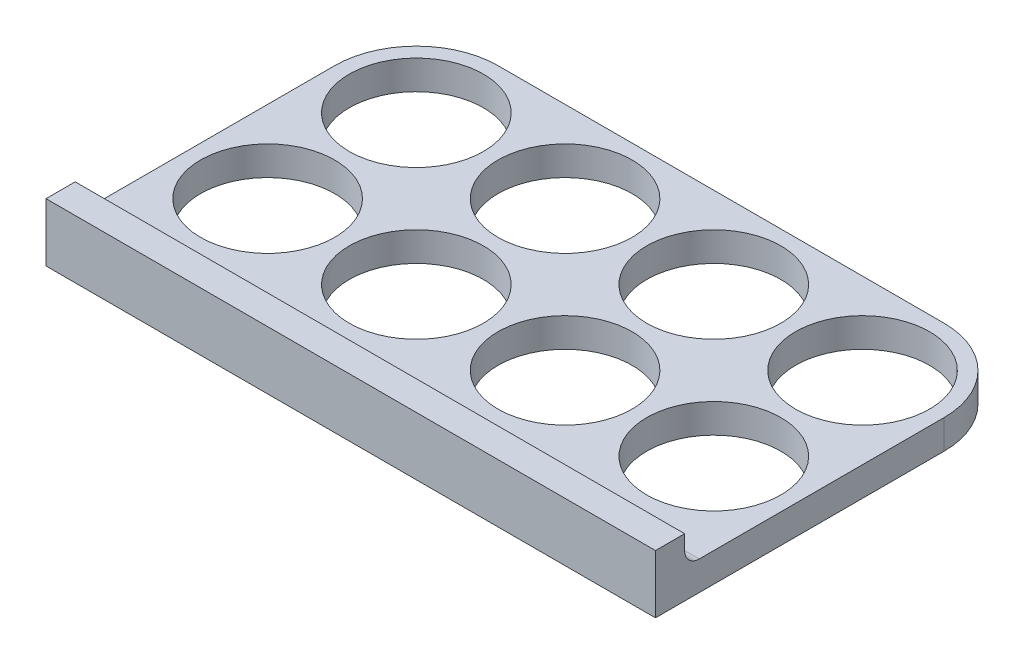
ISO-10303-21;
HEADER;
FILE_DESCRIPTION(('STEP AP214'),'2;1');
FILE_NAME('part.step','',(''),(''),'','','');
FILE_SCHEMA(('AUTOMOTIVE_DESIGN { 1 0 10303 214 1 1 1 1 }'));
ENDSEC;
DATA;
#1=APPLICATION_CONTEXT('core data for automotive mechanical design processes');
#2=APPLICATION_PROTOCOL_DEFINITION('international standard','automotive_design',2000,#1);
#3=PRODUCT_CONTEXT('',#1,'mechanical');
#4=PRODUCT('Part','Part','',(#3));
#5=PRODUCT_RELATED_PRODUCT_CATEGORY('part','',(#4));
#6=PRODUCT_DEFINITION_FORMATION('','',#4);
#7=PRODUCT_DEFINITION_CONTEXT('part definition',#1,'design');
#8=PRODUCT_DEFINITION('design','',#6,#7);
#9=PRODUCT_DEFINITION_SHAPE('','',#8);
#10=(LENGTH_UNIT() NAMED_UNIT(*) SI_UNIT(.MILLI.,.METRE.));
#11=(NAMED_UNIT(*) PLANE_ANGLE_UNIT() SI_UNIT($,.RADIAN.));
#12=(NAMED_UNIT(*) SI_UNIT($,.STERADIAN.) SOLID_ANGLE_UNIT());
#13=UNCERTAINTY_MEASURE_WITH_UNIT(LENGTH_MEASURE(1.E-05),#10,'distance_accuracy_value','');
#14=(GEOMETRIC_REPRESENTATION_CONTEXT(3) GLOBAL_UNCERTAINTY_ASSIGNED_CONTEXT((#13)) GLOBAL_UNIT_ASSIGNED_CONTEXT((#10,
#11,#12)) REPRESENTATION_CONTEXT('',''));
#15=CARTESIAN_POINT('',(0.,0.,0.));
#16=DIRECTION('',(0.,0.,1.));
#17=DIRECTION('',(1.,0.,0.));
#18=AXIS2_PLACEMENT_3D('',#15,#16,#17);
#19=CARTESIAN_POINT('',(0.,4.,-20.4));
#20=DIRECTION('',(0.,1.,0.));
#21=DIRECTION('',(0.,0.,1.));
#22=AXIS2_PLACEMENT_3D('',#19,#20,#21);
#23=PLANE('',#22);
#24=CARTESIAN_POINT('',(61.1999999999999,4.,-20.4));
#25=DIRECTION('',(0.,1.,0.));
#26=DIRECTION('',(0.,0.,1.));
#27=AXIS2_PLACEMENT_3D('',#24,#25,#26);
#28=CIRCLE('',#27,9.2);
#29=CARTESIAN_POINT('',(61.1999999999999,4.,-11.2));
#30=VERTEX_POINT('',#29);
#31=EDGE_CURVE('E146',#30,#30,#28,.T.);
#32=ORIENTED_EDGE('',*,*,#31,.F.);
#33=EDGE_LOOP('',(#32));
#34=FACE_BOUND('',#33,.T.);
#35=CARTESIAN_POINT('',(20.3999999999999,4.,-20.4));
#36=DIRECTION('',(0.,1.,0.));
#37=DIRECTION('',(0.,0.,1.));
#38=AXIS2_PLACEMENT_3D('',#35,#36,#37);
#39=CIRCLE('',#38,9.2);
#40=CARTESIAN_POINT('',(20.3999999999999,4.,-11.2));
#41=VERTEX_POINT('',#40);
#42=EDGE_CURVE('E158',#41,#41,#39,.T.);
#43=ORIENTED_EDGE('',*,*,#42,.F.);
#44=EDGE_LOOP('',(#43));
#45=FACE_BOUND('',#44,.T.);
#46=CARTESIAN_POINT('',(40.8,4.,0.));
#47=DIRECTION('',(0.,1.,0.));
#48=DIRECTION('',(0.,0.,1.));
#49=AXIS2_PLACEMENT_3D('',#46,#47,#48);
#50=CIRCLE('',#49,9.2);
#51=CARTESIAN_POINT('',(40.8,4.,9.2));
#52=VERTEX_POINT('',#51);
#53=EDGE_CURVE('E170',#52,#52,#50,.T.);
#54=ORIENTED_EDGE('',*,*,#53,.F.);
#55=EDGE_LOOP('',(#54));
#56=FACE_BOUND('',#55,.T.);
#57=CARTESIAN_POINT('',(0.,4.,0.));
#58=DIRECTION('',(0.,1.,0.));
#59=DIRECTION('',(0.,0.,1.));
#60=AXIS2_PLACEMENT_3D('',#57,#58,#59);
#61=CIRCLE('',#60,9.2);
#62=CARTESIAN_POINT('',(0.,4.,9.2));
#63=VERTEX_POINT('',#62);
#64=EDGE_CURVE('E182',#63,#63,#61,.T.);
#65=ORIENTED_EDGE('',*,*,#64,.F.);
#66=EDGE_LOOP('',(#65));
#67=FACE_BOUND('',#66,.T.);
#68=CARTESIAN_POINT('',(20.4,4.,0.));
#69=DIRECTION('',(0.,1.,0.));
#70=DIRECTION('',(0.,0.,1.));
#71=AXIS2_PLACEMENT_3D('',#68,#69,#70);
#72=CIRCLE('',#71,9.2);
#73=CARTESIAN_POINT('',(20.4,4.,9.2));
#74=VERTEX_POINT('',#73);
#75=EDGE_CURVE('E176',#74,#74,#72,.T.);
#76=ORIENTED_EDGE('',*,*,#75,.F.);
#77=EDGE_LOOP('',(#76));
#78=FACE_BOUND('',#77,.T.);
#79=CARTESIAN_POINT('',(61.2,4.,0.));
#80=DIRECTION('',(0.,1.,0.));
#81=DIRECTION('',(0.,0.,1.));
#82=AXIS2_PLACEMENT_3D('',#79,#80,#81);
#83=CIRCLE('',#82,9.2);
#84=CARTESIAN_POINT('',(61.2,4.,9.2));
#85=VERTEX_POINT('',#84);
#86=EDGE_CURVE('E164',#85,#85,#83,.T.);
#87=ORIENTED_EDGE('',*,*,#86,.F.);
#88=EDGE_LOOP('',(#87));
#89=FACE_BOUND('',#88,.T.);
#90=CARTESIAN_POINT('',(40.7999999999999,4.,-20.4));
#91=DIRECTION('',(0.,1.,0.));
#92=DIRECTION('',(0.,0.,1.));
#93=AXIS2_PLACEMENT_3D('',#90,#91,#92);
#94=CIRCLE('',#93,9.2);
#95=CARTESIAN_POINT('',(40.7999999999999,4.,-11.2));
#96=VERTEX_POINT('',#95);
#97=EDGE_CURVE('E152',#96,#96,#94,.T.);
#98=ORIENTED_EDGE('',*,*,#97,.F.);
#99=EDGE_LOOP('',(#98));
#100=FACE_BOUND('',#99,.T.);
#101=CARTESIAN_POINT('',(0.,4.,-20.4));
#102=DIRECTION('',(0.,1.,0.));
#103=DIRECTION('',(0.,0.,1.));
#104=AXIS2_PLACEMENT_3D('',#101,#102,#103);
#105=CIRCLE('',#104,9.2);
#106=CARTESIAN_POINT('',(0.,4.,-11.2));
#107=VERTEX_POINT('',#106);
#108=EDGE_CURVE('E140',#107,#107,#105,.T.);
#109=ORIENTED_EDGE('',*,*,#108,.F.);
#110=EDGE_LOOP('',(#109));
#111=FACE_BOUND('',#110,.T.);
#112=DIRECTION('',(0.,0.,1.));
#113=VECTOR('',#112,1.);
#114=CARTESIAN_POINT('',(-11.2000000000001,4.,-20.4));
#115=LINE('',#114,#113);
#116=CARTESIAN_POINT('',(-11.2000000000001,4.,-20.4));
#117=VERTEX_POINT('',#116);
#118=CARTESIAN_POINT('',(-11.2000000000001,4.,13.2));
#119=VERTEX_POINT('',#118);
#120=EDGE_CURVE('E191',#117,#119,#115,.T.);
#121=ORIENTED_EDGE('',*,*,#120,.T.);
#122=DIRECTION('',(1.,0.,0.));
#123=VECTOR('',#122,1.);
#124=CARTESIAN_POINT('',(72.3999999999999,4.,13.2));
#125=LINE('',#124,#123);
#126=CARTESIAN_POINT('',(72.3999999999999,4.,13.2));
#127=VERTEX_POINT('',#126);
#128=EDGE_CURVE('E228',#119,#127,#125,.T.);
#129=ORIENTED_EDGE('',*,*,#128,.T.);
#130=DIRECTION('',(0.,0.,-1.));
#131=VECTOR('',#130,1.);
#132=CARTESIAN_POINT('',(72.3999999999999,4.,19.2));
#133=LINE('',#132,#131);
#134=CARTESIAN_POINT('',(72.3999999999999,4.,-20.4));
#135=VERTEX_POINT('',#134);
#136=EDGE_CURVE('E195',#127,#135,#133,.T.);
#137=ORIENTED_EDGE('',*,*,#136,.T.);
#138=CARTESIAN_POINT('',(61.1999999999999,4.,-20.4));
#139=DIRECTION('',(0.,1.,0.));
#140=DIRECTION('',(0.,0.,1.));
#141=AXIS2_PLACEMENT_3D('',#138,#139,#140);
#142=CIRCLE('',#141,11.2);
#143=CARTESIAN_POINT('',(61.1999999999999,4.,-31.6));
#144=VERTEX_POINT('',#143);
#145=EDGE_CURVE('E197',#135,#144,#142,.T.);
#146=ORIENTED_EDGE('',*,*,#145,.T.);
#147=DIRECTION('',(-1.,0.,0.));
#148=VECTOR('',#147,1.);
#149=CARTESIAN_POINT('',(0.,4.,-31.6));
#150=LINE('',#149,#148);
#151=CARTESIAN_POINT('',(0.,4.,-31.6));
#152=VERTEX_POINT('',#151);
#153=EDGE_CURVE('E199',#144,#152,#150,.T.);
#154=ORIENTED_EDGE('',*,*,#153,.T.);
#155=CARTESIAN_POINT('',(0.,4.,-20.4));
#156=DIRECTION('',(0.,1.,0.));
#157=DIRECTION('',(0.,0.,1.));
#158=AXIS2_PLACEMENT_3D('',#155,#156,#157);
#159=CIRCLE('',#158,11.2);
#160=EDGE_CURVE('E188',#152,#117,#159,.T.);
#161=ORIENTED_EDGE('',*,*,#160,.T.);
#162=EDGE_LOOP('',(#121,#129,#137,#146,#154,#161));
#163=FACE_BOUND('',#162,.T.);
#164=ADVANCED_FACE('F44',(#34,#45,#56,#67,#78,#89,#100,#111,#163),#23,.T.);
#165=CARTESIAN_POINT('',(0.,0.,-20.4));
#166=DIRECTION('',(0.,1.,0.));
#167=DIRECTION('',(0.,0.,1.));
#168=AXIS2_PLACEMENT_3D('',#165,#166,#167);
#169=PLANE('',#168);
#170=CARTESIAN_POINT('',(0.,0.,-20.4));
#171=DIRECTION('',(0.,1.,0.));
#172=DIRECTION('',(0.,0.,1.));
#173=AXIS2_PLACEMENT_3D('',#170,#171,#172);
#174=CIRCLE('',#173,11.2);
#175=CARTESIAN_POINT('',(0.,0.,-31.6));
#176=VERTEX_POINT('',#175);
#177=CARTESIAN_POINT('',(-11.2000000000001,0.,-20.4));
#178=VERTEX_POINT('',#177);
#179=EDGE_CURVE('E185',#176,#178,#174,.T.);
#180=ORIENTED_EDGE('',*,*,#179,.F.);
#181=DIRECTION('',(-1.,0.,0.));
#182=VECTOR('',#181,1.);
#183=CARTESIAN_POINT('',(0.,0.,-31.6));
#184=LINE('',#183,#182);
#185=CARTESIAN_POINT('',(61.1999999999999,0.,-31.6));
#186=VERTEX_POINT('',#185);
#187=EDGE_CURVE('E192',#186,#176,#184,.T.);
#188=ORIENTED_EDGE('',*,*,#187,.F.);
#189=CARTESIAN_POINT('',(61.1999999999999,0.,-20.4));
#190=DIRECTION('',(0.,1.,0.));
#191=DIRECTION('',(0.,0.,1.));
#192=AXIS2_PLACEMENT_3D('',#189,#190,#191);
#193=CIRCLE('',#192,11.2);
#194=CARTESIAN_POINT('',(72.3999999999999,0.,-20.4));
#195=VERTEX_POINT('',#194);
#196=EDGE_CURVE('E210',#195,#186,#193,.T.);
#197=ORIENTED_EDGE('',*,*,#196,.F.);
#198=DIRECTION('',(0.,0.,-1.));
#199=VECTOR('',#198,1.);
#200=CARTESIAN_POINT('',(72.3999999999999,0.,19.2));
#201=LINE('',#200,#199);
#202=CARTESIAN_POINT('',(72.3999999999999,0.,19.2));
#203=VERTEX_POINT('',#202);
#204=EDGE_CURVE('E208',#203,#195,#201,.T.);
#205=ORIENTED_EDGE('',*,*,#204,.F.);
#206=DIRECTION('',(1.,0.,0.));
#207=VECTOR('',#206,1.);
#208=CARTESIAN_POINT('',(-11.2000000000001,0.,19.2));
#209=LINE('',#208,#207);
#210=CARTESIAN_POINT('',(-11.2000000000001,0.,19.2));
#211=VERTEX_POINT('',#210);
#212=EDGE_CURVE('E206',#211,#203,#209,.T.);
#213=ORIENTED_EDGE('',*,*,#212,.F.);
#214=DIRECTION('',(0.,0.,1.));
#215=VECTOR('',#214,1.);
#216=CARTESIAN_POINT('',(-11.2000000000001,0.,-20.4));
#217=LINE('',#216,#215);
#218=EDGE_CURVE('E204',#178,#211,#217,.T.);
#219=ORIENTED_EDGE('',*,*,#218,.F.);
#220=EDGE_LOOP('',(#180,#188,#197,#205,#213,#219));
#221=FACE_BOUND('',#220,.T.);
#222=CARTESIAN_POINT('',(0.,0.,0.));
#223=DIRECTION('',(0.,1.,0.));
#224=DIRECTION('',(0.,0.,1.));
#225=AXIS2_PLACEMENT_3D('',#222,#223,#224);
#226=CIRCLE('',#225,9.2);
#227=CARTESIAN_POINT('',(0.,0.,9.2));
#228=VERTEX_POINT('',#227);
#229=EDGE_CURVE('E179',#228,#228,#226,.T.);
#230=ORIENTED_EDGE('',*,*,#229,.T.);
#231=EDGE_LOOP('',(#230));
#232=FACE_BOUND('',#231,.T.);
#233=CARTESIAN_POINT('',(20.4,0.,0.));
#234=DIRECTION('',(0.,1.,0.));
#235=DIRECTION('',(0.,0.,1.));
#236=AXIS2_PLACEMENT_3D('',#233,#234,#235);
#237=CIRCLE('',#236,9.2);
#238=CARTESIAN_POINT('',(20.4,0.,9.2));
#239=VERTEX_POINT('',#238);
#240=EDGE_CURVE('E173',#239,#239,#237,.T.);
#241=ORIENTED_EDGE('',*,*,#240,.T.);
#242=EDGE_LOOP('',(#241));
#243=FACE_BOUND('',#242,.T.);
#244=CARTESIAN_POINT('',(40.8,0.,0.));
#245=DIRECTION('',(0.,1.,0.));
#246=DIRECTION('',(0.,0.,1.));
#247=AXIS2_PLACEMENT_3D('',#244,#245,#246);
#248=CIRCLE('',#247,9.2);
#249=CARTESIAN_POINT('',(40.8,0.,9.2));
#250=VERTEX_POINT('',#249);
#251=EDGE_CURVE('E167',#250,#250,#248,.T.);
#252=ORIENTED_EDGE('',*,*,#251,.T.);
#253=EDGE_LOOP('',(#252));
#254=FACE_BOUND('',#253,.T.);
#255=CARTESIAN_POINT('',(61.2,0.,0.));
#256=DIRECTION('',(0.,1.,0.));
#257=DIRECTION('',(0.,0.,1.));
#258=AXIS2_PLACEMENT_3D('',#255,#256,#257);
#259=CIRCLE('',#258,9.2);
#260=CARTESIAN_POINT('',(61.2,0.,9.2));
#261=VERTEX_POINT('',#260);
#262=EDGE_CURVE('E161',#261,#261,#259,.T.);
#263=ORIENTED_EDGE('',*,*,#262,.T.);
#264=EDGE_LOOP('',(#263));
#265=FACE_BOUND('',#264,.T.);
#266=CARTESIAN_POINT('',(20.3999999999999,0.,-20.4));
#267=DIRECTION('',(0.,1.,0.));
#268=DIRECTION('',(0.,0.,1.));
#269=AXIS2_PLACEMENT_3D('',#266,#267,#268);
#270=CIRCLE('',#269,9.2);
#271=CARTESIAN_POINT('',(20.3999999999999,0.,-11.2));
#272=VERTEX_POINT('',#271);
#273=EDGE_CURVE('E155',#272,#272,#270,.T.);
#274=ORIENTED_EDGE('',*,*,#273,.T.);
#275=EDGE_LOOP('',(#274));
#276=FACE_BOUND('',#275,.T.);
#277=CARTESIAN_POINT('',(40.7999999999999,0.,-20.4));
#278=DIRECTION('',(0.,1.,0.));
#279=DIRECTION('',(0.,0.,1.));
#280=AXIS2_PLACEMENT_3D('',#277,#278,#279);
#281=CIRCLE('',#280,9.2);
#282=CARTESIAN_POINT('',(40.7999999999999,0.,-11.2));
#283=VERTEX_POINT('',#282);
#284=EDGE_CURVE('E149',#283,#283,#281,.T.);
#285=ORIENTED_EDGE('',*,*,#284,.T.);
#286=EDGE_LOOP('',(#285));
#287=FACE_BOUND('',#286,.T.);
#288=CARTESIAN_POINT('',(61.1999999999999,0.,-20.4));
#289=DIRECTION('',(0.,1.,0.));
#290=DIRECTION('',(0.,0.,1.));
#291=AXIS2_PLACEMENT_3D('',#288,#289,#290);
#292=CIRCLE('',#291,9.2);
#293=CARTESIAN_POINT('',(61.1999999999999,0.,-11.2));
#294=VERTEX_POINT('',#293);
#295=EDGE_CURVE('E143',#294,#294,#292,.T.);
#296=ORIENTED_EDGE('',*,*,#295,.T.);
#297=EDGE_LOOP('',(#296));
#298=FACE_BOUND('',#297,.T.);
#299=CARTESIAN_POINT('',(0.,0.,-20.4));
#300=DIRECTION('',(0.,1.,0.));
#301=DIRECTION('',(0.,0.,1.));
#302=AXIS2_PLACEMENT_3D('',#299,#300,#301);
#303=CIRCLE('',#302,9.2);
#304=CARTESIAN_POINT('',(0.,0.,-11.2));
#305=VERTEX_POINT('',#304);
#306=EDGE_CURVE('E119',#305,#305,#303,.T.);
#307=ORIENTED_EDGE('',*,*,#306,.T.);
#308=EDGE_LOOP('',(#307));
#309=FACE_BOUND('',#308,.T.);
#310=ADVANCED_FACE('F258',(#221,#232,#243,#254,#265,#276,#287,#298,#309),#169,.F.);
#311=CARTESIAN_POINT('',(0.,4.,-20.4));
#312=DIRECTION('',(0.,-1.,0.));
#313=DIRECTION('',(0.,0.,-1.));
#314=AXIS2_PLACEMENT_3D('',#311,#312,#313);
#315=CYLINDRICAL_SURFACE('',#314,11.2);
#316=ORIENTED_EDGE('',*,*,#179,.T.);
#317=DIRECTION('',(0.,-1.,0.));
#318=VECTOR('',#317,1.);
#319=CARTESIAN_POINT('',(-11.2000000000001,4.,-20.4));
#320=LINE('',#319,#318);
#321=EDGE_CURVE('E225',#117,#178,#320,.T.);
#322=ORIENTED_EDGE('',*,*,#321,.F.);
#323=ORIENTED_EDGE('',*,*,#160,.F.);
#324=DIRECTION('',(0.,-1.,0.));
#325=VECTOR('',#324,1.);
#326=CARTESIAN_POINT('',(0.,4.,-31.6));
#327=LINE('',#326,#325);
#328=EDGE_CURVE('E201',#152,#176,#327,.T.);
#329=ORIENTED_EDGE('',*,*,#328,.T.);
#330=EDGE_LOOP('',(#316,#322,#323,#329));
#331=FACE_BOUND('',#330,.T.);
#332=ADVANCED_FACE('F251',(#331),#315,.T.);
#333=CARTESIAN_POINT('',(-11.2000000000001,4.,-20.4));
#334=DIRECTION('',(1.,0.,0.));
#335=DIRECTION('',(0.,0.,-1.));
#336=AXIS2_PLACEMENT_3D('',#333,#334,#335);
#337=PLANE('',#336);
#338=ORIENTED_EDGE('',*,*,#218,.T.);
#339=DIRECTION('',(0.,-1.,0.));
#340=VECTOR('',#339,1.);
#341=CARTESIAN_POINT('',(-11.2000000000001,4.,19.2));
#342=LINE('',#341,#340);
#343=CARTESIAN_POINT('',(-11.2000000000001,8.,19.2));
#344=VERTEX_POINT('',#343);
#345=EDGE_CURVE('E126',#344,#211,#342,.T.);
#346=ORIENTED_EDGE('',*,*,#345,.F.);
#347=DIRECTION('',(0.,0.,1.));
#348=VECTOR('',#347,1.);
#349=CARTESIAN_POINT('',(-11.2000000000001,8.,0.));
#350=LINE('',#349,#348);
#351=CARTESIAN_POINT('',(-11.2000000000001,8.,15.2));
#352=VERTEX_POINT('',#351);
#353=EDGE_CURVE('E123',#352,#344,#350,.T.);
#354=ORIENTED_EDGE('',*,*,#353,.F.);
#355=DIRECTION('',(0.,-1.,0.));
#356=VECTOR('',#355,1.);
#357=CARTESIAN_POINT('',(-11.2000000000001,8.,15.2));
#358=LINE('',#357,#356);
#359=CARTESIAN_POINT('',(-11.2000000000001,6.,15.2));
#360=VERTEX_POINT('',#359);
#361=EDGE_CURVE('E112',#352,#360,#358,.T.);
#362=ORIENTED_EDGE('',*,*,#361,.T.);
#363=CARTESIAN_POINT('',(-11.2000000000001,6.,13.2));
#364=DIRECTION('',(1.,0.,0.));
#365=DIRECTION('',(0.,0.,-1.));
#366=AXIS2_PLACEMENT_3D('',#363,#364,#365);
#367=CIRCLE('',#366,2.);
#368=EDGE_CURVE('E11',#360,#119,#367,.T.);
#369=ORIENTED_EDGE('',*,*,#368,.T.);
#370=ORIENTED_EDGE('',*,*,#120,.F.);
#371=ORIENTED_EDGE('',*,*,#321,.T.);
#372=EDGE_LOOP('',(#338,#346,#354,#362,#369,#370,#371));
#373=FACE_BOUND('',#372,.T.);
#374=ADVANCED_FACE('F124',(#373),#337,.F.);
#375=CARTESIAN_POINT('',(-11.2000000000001,4.,19.2));
#376=DIRECTION('',(0.,0.,-1.));
#377=DIRECTION('',(-1.,0.,0.));
#378=AXIS2_PLACEMENT_3D('',#375,#376,#377);
#379=PLANE('',#378);
#380=ORIENTED_EDGE('',*,*,#212,.T.);
#381=DIRECTION('',(0.,-1.,0.));
#382=VECTOR('',#381,1.);
#383=CARTESIAN_POINT('',(72.3999999999999,4.,19.2));
#384=LINE('',#383,#382);
#385=CARTESIAN_POINT('',(72.3999999999999,8.,19.2));
#386=VERTEX_POINT('',#385);
#387=EDGE_CURVE('E221',#386,#203,#384,.T.);
#388=ORIENTED_EDGE('',*,*,#387,.F.);
#389=DIRECTION('',(1.,0.,0.));
#390=VECTOR('',#389,1.);
#391=CARTESIAN_POINT('',(0.,8.,19.2));
#392=LINE('',#391,#390);
#393=EDGE_CURVE('E130',#344,#386,#392,.T.);
#394=ORIENTED_EDGE('',*,*,#393,.F.);
#395=ORIENTED_EDGE('',*,*,#345,.T.);
#396=EDGE_LOOP('',(#380,#388,#394,#395));
#397=FACE_BOUND('',#396,.T.);
#398=ADVANCED_FACE('F278',(#397),#379,.F.);
#399=CARTESIAN_POINT('',(72.3999999999999,4.,19.2));
#400=DIRECTION('',(-1.,0.,0.));
#401=DIRECTION('',(0.,0.,1.));
#402=AXIS2_PLACEMENT_3D('',#399,#400,#401);
#403=PLANE('',#402);
#404=ORIENTED_EDGE('',*,*,#204,.T.);
#405=DIRECTION('',(0.,-1.,0.));
#406=VECTOR('',#405,1.);
#407=CARTESIAN_POINT('',(72.3999999999999,4.,-20.4));
#408=LINE('',#407,#406);
#409=EDGE_CURVE('E218',#135,#195,#408,.T.);
#410=ORIENTED_EDGE('',*,*,#409,.F.);
#411=ORIENTED_EDGE('',*,*,#136,.F.);
#412=CARTESIAN_POINT('',(72.3999999999999,6.,13.2));
#413=DIRECTION('',(-1.,0.,0.));
#414=DIRECTION('',(0.,0.,1.));
#415=AXIS2_PLACEMENT_3D('',#412,#413,#414);
#416=CIRCLE('',#415,2.);
#417=CARTESIAN_POINT('',(72.3999999999999,6.,15.2));
#418=VERTEX_POINT('',#417);
#419=EDGE_CURVE('E52',#127,#418,#416,.T.);
#420=ORIENTED_EDGE('',*,*,#419,.T.);
#421=DIRECTION('',(0.,-1.,0.));
#422=VECTOR('',#421,1.);
#423=CARTESIAN_POINT('',(72.3999999999999,8.,15.2));
#424=LINE('',#423,#422);
#425=CARTESIAN_POINT('',(72.3999999999999,8.,15.2));
#426=VERTEX_POINT('',#425);
#427=EDGE_CURVE('E120',#426,#418,#424,.T.);
#428=ORIENTED_EDGE('',*,*,#427,.F.);
#429=DIRECTION('',(0.,0.,-1.));
#430=VECTOR('',#429,1.);
#431=CARTESIAN_POINT('',(72.3999999999999,8.,0.));
#432=LINE('',#431,#430);
#433=EDGE_CURVE('E134',#386,#426,#432,.T.);
#434=ORIENTED_EDGE('',*,*,#433,.F.);
#435=ORIENTED_EDGE('',*,*,#387,.T.);
#436=EDGE_LOOP('',(#404,#410,#411,#420,#428,#434,#435));
#437=FACE_BOUND('',#436,.T.);
#438=ADVANCED_FACE('F235',(#437),#403,.F.);
#439=CARTESIAN_POINT('',(61.1999999999999,4.,-20.4));
#440=DIRECTION('',(0.,-1.,0.));
#441=DIRECTION('',(0.,0.,-1.));
#442=AXIS2_PLACEMENT_3D('',#439,#440,#441);
#443=CYLINDRICAL_SURFACE('',#442,11.2);
#444=ORIENTED_EDGE('',*,*,#196,.T.);
#445=DIRECTION('',(0.,-1.,0.));
#446=VECTOR('',#445,1.);
#447=CARTESIAN_POINT('',(61.1999999999999,4.,-31.6));
#448=LINE('',#447,#446);
#449=EDGE_CURVE('E215',#144,#186,#448,.T.);
#450=ORIENTED_EDGE('',*,*,#449,.F.);
#451=ORIENTED_EDGE('',*,*,#145,.F.);
#452=ORIENTED_EDGE('',*,*,#409,.T.);
#453=EDGE_LOOP('',(#444,#450,#451,#452));
#454=FACE_BOUND('',#453,.T.);
#455=ADVANCED_FACE('F241',(#454),#443,.T.);
#456=CARTESIAN_POINT('',(0.,4.,-31.6));
#457=DIRECTION('',(0.,0.,1.));
#458=DIRECTION('',(1.,0.,0.));
#459=AXIS2_PLACEMENT_3D('',#456,#457,#458);
#460=PLANE('',#459);
#461=ORIENTED_EDGE('',*,*,#187,.T.);
#462=ORIENTED_EDGE('',*,*,#328,.F.);
#463=ORIENTED_EDGE('',*,*,#153,.F.);
#464=ORIENTED_EDGE('',*,*,#449,.T.);
#465=EDGE_LOOP('',(#461,#462,#463,#464));
#466=FACE_BOUND('',#465,.T.);
#467=ADVANCED_FACE('F247',(#466),#460,.F.);
#468=CARTESIAN_POINT('',(0.,4.,0.));
#469=DIRECTION('',(0.,-1.,0.));
#470=DIRECTION('',(0.,0.,-1.));
#471=AXIS2_PLACEMENT_3D('',#468,#469,#470);
#472=CYLINDRICAL_SURFACE('',#471,9.2);
#473=ORIENTED_EDGE('',*,*,#64,.T.);
#474=EDGE_LOOP('',(#473));
#475=FACE_BOUND('',#474,.T.);
#476=ORIENTED_EDGE('',*,*,#229,.F.);
#477=EDGE_LOOP('',(#476));
#478=FACE_BOUND('',#477,.T.);
#479=ADVANCED_FACE('F269',(#475,#478),#472,.F.);
#480=CARTESIAN_POINT('',(20.4,4.,0.));
#481=DIRECTION('',(0.,-1.,0.));
#482=DIRECTION('',(0.,0.,-1.));
#483=AXIS2_PLACEMENT_3D('',#480,#481,#482);
#484=CYLINDRICAL_SURFACE('',#483,9.2);
#485=ORIENTED_EDGE('',*,*,#75,.T.);
#486=EDGE_LOOP('',(#485));
#487=FACE_BOUND('',#486,.T.);
#488=ORIENTED_EDGE('',*,*,#240,.F.);
#489=EDGE_LOOP('',(#488));
#490=FACE_BOUND('',#489,.T.);
#491=ADVANCED_FACE('F314',(#487,#490),#484,.F.);
#492=CARTESIAN_POINT('',(40.8,4.,0.));
#493=DIRECTION('',(0.,-1.,0.));
#494=DIRECTION('',(0.,0.,-1.));
#495=AXIS2_PLACEMENT_3D('',#492,#493,#494);
#496=CYLINDRICAL_SURFACE('',#495,9.2);
#497=ORIENTED_EDGE('',*,*,#53,.T.);
#498=EDGE_LOOP('',(#497));
#499=FACE_BOUND('',#498,.T.);
#500=ORIENTED_EDGE('',*,*,#251,.F.);
#501=EDGE_LOOP('',(#500));
#502=FACE_BOUND('',#501,.T.);
#503=ADVANCED_FACE('F321',(#499,#502),#496,.F.);
#504=CARTESIAN_POINT('',(61.2,4.,0.));
#505=DIRECTION('',(0.,-1.,0.));
#506=DIRECTION('',(0.,0.,-1.));
#507=AXIS2_PLACEMENT_3D('',#504,#505,#506);
#508=CYLINDRICAL_SURFACE('',#507,9.2);
#509=ORIENTED_EDGE('',*,*,#86,.T.);
#510=EDGE_LOOP('',(#509));
#511=FACE_BOUND('',#510,.T.);
#512=ORIENTED_EDGE('',*,*,#262,.F.);
#513=EDGE_LOOP('',(#512));
#514=FACE_BOUND('',#513,.T.);
#515=ADVANCED_FACE('F328',(#511,#514),#508,.F.);
#516=CARTESIAN_POINT('',(20.3999999999999,4.,-20.4));
#517=DIRECTION('',(0.,-1.,0.));
#518=DIRECTION('',(0.,0.,-1.));
#519=AXIS2_PLACEMENT_3D('',#516,#517,#518);
#520=CYLINDRICAL_SURFACE('',#519,9.2);
#521=ORIENTED_EDGE('',*,*,#42,.T.);
#522=EDGE_LOOP('',(#521));
#523=FACE_BOUND('',#522,.T.);
#524=ORIENTED_EDGE('',*,*,#273,.F.);
#525=EDGE_LOOP('',(#524));
#526=FACE_BOUND('',#525,.T.);
#527=ADVANCED_FACE('F336',(#523,#526),#520,.F.);
#528=CARTESIAN_POINT('',(40.7999999999999,4.,-20.4));
#529=DIRECTION('',(0.,-1.,0.));
#530=DIRECTION('',(0.,0.,-1.));
#531=AXIS2_PLACEMENT_3D('',#528,#529,#530);
#532=CYLINDRICAL_SURFACE('',#531,9.2);
#533=ORIENTED_EDGE('',*,*,#97,.T.);
#534=EDGE_LOOP('',(#533));
#535=FACE_BOUND('',#534,.T.);
#536=ORIENTED_EDGE('',*,*,#284,.F.);
#537=EDGE_LOOP('',(#536));
#538=FACE_BOUND('',#537,.T.);
#539=ADVANCED_FACE('F344',(#535,#538),#532,.F.);
#540=CARTESIAN_POINT('',(61.1999999999999,4.,-20.4));
#541=DIRECTION('',(0.,-1.,0.));
#542=DIRECTION('',(0.,0.,-1.));
#543=AXIS2_PLACEMENT_3D('',#540,#541,#542);
#544=CYLINDRICAL_SURFACE('',#543,9.2);
#545=ORIENTED_EDGE('',*,*,#31,.T.);
#546=EDGE_LOOP('',(#545));
#547=FACE_BOUND('',#546,.T.);
#548=ORIENTED_EDGE('',*,*,#295,.F.);
#549=EDGE_LOOP('',(#548));
#550=FACE_BOUND('',#549,.T.);
#551=ADVANCED_FACE('F352',(#547,#550),#544,.F.);
#552=CARTESIAN_POINT('',(0.,4.,-20.4));
#553=DIRECTION('',(0.,-1.,0.));
#554=DIRECTION('',(0.,0.,-1.));
#555=AXIS2_PLACEMENT_3D('',#552,#553,#554);
#556=CYLINDRICAL_SURFACE('',#555,9.2);
#557=ORIENTED_EDGE('',*,*,#108,.T.);
#558=EDGE_LOOP('',(#557));
#559=FACE_BOUND('',#558,.T.);
#560=ORIENTED_EDGE('',*,*,#306,.F.);
#561=EDGE_LOOP('',(#560));
#562=FACE_BOUND('',#561,.T.);
#563=ADVANCED_FACE('F360',(#559,#562),#556,.F.);
#564=CARTESIAN_POINT('',(0.,8.,15.2));
#565=DIRECTION('',(0.,0.,-1.));
#566=DIRECTION('',(-1.,0.,0.));
#567=AXIS2_PLACEMENT_3D('',#564,#565,#566);
#568=PLANE('',#567);
#569=ORIENTED_EDGE('',*,*,#427,.T.);
#570=DIRECTION('',(1.,0.,0.));
#571=VECTOR('',#570,1.);
#572=CARTESIAN_POINT('',(-11.2000000000001,6.,15.2));
#573=LINE('',#572,#571);
#574=EDGE_CURVE('E65',#418,#360,#573,.F.);
#575=ORIENTED_EDGE('',*,*,#574,.T.);
#576=ORIENTED_EDGE('',*,*,#361,.F.);
#577=DIRECTION('',(1.,0.,0.));
#578=VECTOR('',#577,1.);
#579=CARTESIAN_POINT('',(0.,8.,15.2));
#580=LINE('',#579,#578);
#581=EDGE_CURVE('E116',#352,#426,#580,.T.);
#582=ORIENTED_EDGE('',*,*,#581,.T.);
#583=EDGE_LOOP('',(#569,#575,#576,#582));
#584=FACE_BOUND('',#583,.T.);
#585=ADVANCED_FACE('F114',(#584),#568,.T.);
#586=CARTESIAN_POINT('',(0.,8.,0.));
#587=DIRECTION('',(0.,1.,0.));
#588=DIRECTION('',(0.,0.,1.));
#589=AXIS2_PLACEMENT_3D('',#586,#587,#588);
#590=PLANE('',#589);
#591=ORIENTED_EDGE('',*,*,#581,.F.);
#592=ORIENTED_EDGE('',*,*,#353,.T.);
#593=ORIENTED_EDGE('',*,*,#393,.T.);
#594=ORIENTED_EDGE('',*,*,#433,.T.);
#595=EDGE_LOOP('',(#591,#592,#593,#594));
#596=FACE_BOUND('',#595,.T.);
#597=ADVANCED_FACE('F132',(#596),#590,.T.);
#598=CARTESIAN_POINT('',(0.,6.,13.2));
#599=DIRECTION('',(-1.,0.,0.));
#600=DIRECTION('',(0.,0.,1.));
#601=AXIS2_PLACEMENT_3D('',#598,#599,#600);
#602=CYLINDRICAL_SURFACE('',#601,2.);
#603=ORIENTED_EDGE('',*,*,#368,.F.);
#604=ORIENTED_EDGE('',*,*,#574,.F.);
#605=ORIENTED_EDGE('',*,*,#419,.F.);
#606=ORIENTED_EDGE('',*,*,#128,.F.);
#607=EDGE_LOOP('',(#603,#604,#605,#606));
#608=FACE_BOUND('',#607,.T.);
#609=ADVANCED_FACE('F46',(#608),#602,.F.);
#610=CLOSED_SHELL('',(#164,#310,#332,#374,#398,#438,#455,#467,#479,#491,#503,#515,#527,#539,
#551,#563,#585,#597,#609));
#611=MANIFOLD_SOLID_BREP('B2',#610);
#612=ADVANCED_BREP_SHAPE_REPRESENTATION('',(#18,#611),#14);
#613=SHAPE_DEFINITION_REPRESENTATION(#9,#612);
ENDSEC;
END-ISO-10303-21;
